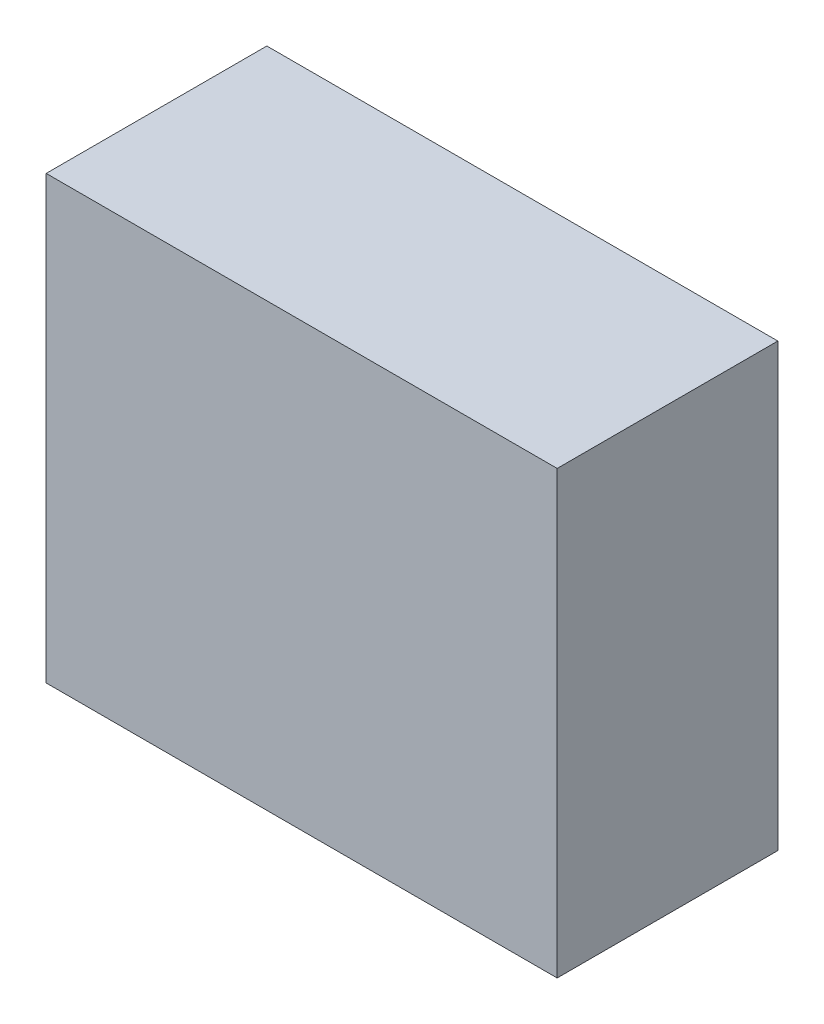
ISO-10303-21;
HEADER;
FILE_DESCRIPTION(('STEP AP214'),'2;1');
FILE_NAME('part.step','',(''),(''),'','','');
FILE_SCHEMA(('AUTOMOTIVE_DESIGN { 1 0 10303 214 1 1 1 1 }'));
ENDSEC;
DATA;
#1=APPLICATION_CONTEXT('core data for automotive mechanical design processes');
#2=APPLICATION_PROTOCOL_DEFINITION('international standard','automotive_design',2000,#1);
#3=PRODUCT_CONTEXT('',#1,'mechanical');
#4=PRODUCT('Part','Part','',(#3));
#5=PRODUCT_RELATED_PRODUCT_CATEGORY('part','',(#4));
#6=PRODUCT_DEFINITION_FORMATION('','',#4);
#7=PRODUCT_DEFINITION_CONTEXT('part definition',#1,'design');
#8=PRODUCT_DEFINITION('design','',#6,#7);
#9=PRODUCT_DEFINITION_SHAPE('','',#8);
#10=(LENGTH_UNIT() NAMED_UNIT(*) SI_UNIT(.MILLI.,.METRE.));
#11=(NAMED_UNIT(*) PLANE_ANGLE_UNIT() SI_UNIT($,.RADIAN.));
#12=(NAMED_UNIT(*) SI_UNIT($,.STERADIAN.) SOLID_ANGLE_UNIT());
#13=UNCERTAINTY_MEASURE_WITH_UNIT(LENGTH_MEASURE(1.E-05),#10,'distance_accuracy_value','');
#14=(GEOMETRIC_REPRESENTATION_CONTEXT(3) GLOBAL_UNCERTAINTY_ASSIGNED_CONTEXT((#13)) GLOBAL_UNIT_ASSIGNED_CONTEXT((#10,
#11,#12)) REPRESENTATION_CONTEXT('',''));
#15=CARTESIAN_POINT('',(0.,0.,0.));
#16=DIRECTION('',(0.,0.,1.));
#17=DIRECTION('',(1.,0.,0.));
#18=AXIS2_PLACEMENT_3D('',#15,#16,#17);
#19=CARTESIAN_POINT('',(-46.,-42.,119.));
#20=DIRECTION('',(1.,0.,0.));
#21=DIRECTION('',(0.,0.,-1.));
#22=AXIS2_PLACEMENT_3D('',#19,#20,#21);
#23=PLANE('',#22);
#24=DIRECTION('',(0.,-1.,0.));
#25=VECTOR('',#24,1.);
#26=CARTESIAN_POINT('',(-46.,-42.,100.));
#27=LINE('',#26,#25);
#28=CARTESIAN_POINT('',(-46.,-42.,100.));
#29=VERTEX_POINT('',#28);
#30=CARTESIAN_POINT('',(-46.,-80.,100.));
#31=VERTEX_POINT('',#30);
#32=EDGE_CURVE('E105',#29,#31,#27,.T.);
#33=ORIENTED_EDGE('',*,*,#32,.T.);
#34=DIRECTION('',(0.,0.,-1.));
#35=VECTOR('',#34,1.);
#36=CARTESIAN_POINT('',(-46.,-80.,119.));
#37=LINE('',#36,#35);
#38=CARTESIAN_POINT('',(-46.,-80.,119.));
#39=VERTEX_POINT('',#38);
#40=EDGE_CURVE('E11',#39,#31,#37,.T.);
#41=ORIENTED_EDGE('',*,*,#40,.F.);
#42=DIRECTION('',(0.,-1.,0.));
#43=VECTOR('',#42,1.);
#44=CARTESIAN_POINT('',(-46.,-42.,119.));
#45=LINE('',#44,#43);
#46=CARTESIAN_POINT('',(-46.,-42.,119.));
#47=VERTEX_POINT('',#46);
#48=EDGE_CURVE('E89',#47,#39,#45,.T.);
#49=ORIENTED_EDGE('',*,*,#48,.F.);
#50=DIRECTION('',(0.,0.,-1.));
#51=VECTOR('',#50,1.);
#52=CARTESIAN_POINT('',(-46.,-42.,119.));
#53=LINE('',#52,#51);
#54=EDGE_CURVE('E97',#47,#29,#53,.T.);
#55=ORIENTED_EDGE('',*,*,#54,.T.);
#56=EDGE_LOOP('',(#33,#41,#49,#55));
#57=FACE_BOUND('',#56,.T.);
#58=ADVANCED_FACE('F39',(#57),#23,.F.);
#59=CARTESIAN_POINT('',(-46.,-80.,119.));
#60=DIRECTION('',(0.,1.,0.));
#61=DIRECTION('',(0.,0.,1.));
#62=AXIS2_PLACEMENT_3D('',#59,#60,#61);
#63=PLANE('',#62);
#64=DIRECTION('',(1.,0.,0.));
#65=VECTOR('',#64,1.);
#66=CARTESIAN_POINT('',(-46.,-80.,100.));
#67=LINE('',#66,#65);
#68=CARTESIAN_POINT('',(-2.,-80.,100.));
#69=VERTEX_POINT('',#68);
#70=EDGE_CURVE('E92',#31,#69,#67,.T.);
#71=ORIENTED_EDGE('',*,*,#70,.T.);
#72=DIRECTION('',(0.,0.,-1.));
#73=VECTOR('',#72,1.);
#74=CARTESIAN_POINT('',(-2.,-80.,119.));
#75=LINE('',#74,#73);
#76=CARTESIAN_POINT('',(-2.,-80.,119.));
#77=VERTEX_POINT('',#76);
#78=EDGE_CURVE('E50',#77,#69,#75,.T.);
#79=ORIENTED_EDGE('',*,*,#78,.F.);
#80=DIRECTION('',(1.,0.,0.));
#81=VECTOR('',#80,1.);
#82=CARTESIAN_POINT('',(-46.,-80.,119.));
#83=LINE('',#82,#81);
#84=EDGE_CURVE('E82',#39,#77,#83,.T.);
#85=ORIENTED_EDGE('',*,*,#84,.F.);
#86=ORIENTED_EDGE('',*,*,#40,.T.);
#87=EDGE_LOOP('',(#71,#79,#85,#86));
#88=FACE_BOUND('',#87,.T.);
#89=ADVANCED_FACE('F93',(#88),#63,.F.);
#90=CARTESIAN_POINT('',(-2.,-80.,119.));
#91=DIRECTION('',(-1.,0.,0.));
#92=DIRECTION('',(0.,0.,1.));
#93=AXIS2_PLACEMENT_3D('',#90,#91,#92);
#94=PLANE('',#93);
#95=DIRECTION('',(0.,1.,0.));
#96=VECTOR('',#95,1.);
#97=CARTESIAN_POINT('',(-2.,-80.,100.));
#98=LINE('',#97,#96);
#99=CARTESIAN_POINT('',(-2.,-42.,100.));
#100=VERTEX_POINT('',#99);
#101=EDGE_CURVE('E74',#69,#100,#98,.T.);
#102=ORIENTED_EDGE('',*,*,#101,.T.);
#103=DIRECTION('',(0.,0.,-1.));
#104=VECTOR('',#103,1.);
#105=CARTESIAN_POINT('',(-2.,-42.,119.));
#106=LINE('',#105,#104);
#107=CARTESIAN_POINT('',(-2.,-42.,119.));
#108=VERTEX_POINT('',#107);
#109=EDGE_CURVE('E94',#108,#100,#106,.T.);
#110=ORIENTED_EDGE('',*,*,#109,.F.);
#111=DIRECTION('',(0.,1.,0.));
#112=VECTOR('',#111,1.);
#113=CARTESIAN_POINT('',(-2.,-80.,119.));
#114=LINE('',#113,#112);
#115=EDGE_CURVE('E88',#77,#108,#114,.T.);
#116=ORIENTED_EDGE('',*,*,#115,.F.);
#117=ORIENTED_EDGE('',*,*,#78,.T.);
#118=EDGE_LOOP('',(#102,#110,#116,#117));
#119=FACE_BOUND('',#118,.T.);
#120=ADVANCED_FACE('F96',(#119),#94,.F.);
#121=CARTESIAN_POINT('',(-2.,-42.,119.));
#122=DIRECTION('',(0.,-1.,0.));
#123=DIRECTION('',(0.,0.,-1.));
#124=AXIS2_PLACEMENT_3D('',#121,#122,#123);
#125=PLANE('',#124);
#126=DIRECTION('',(-1.,0.,0.));
#127=VECTOR('',#126,1.);
#128=CARTESIAN_POINT('',(-2.,-42.,100.));
#129=LINE('',#128,#127);
#130=EDGE_CURVE('E76',#100,#29,#129,.T.);
#131=ORIENTED_EDGE('',*,*,#130,.T.);
#132=ORIENTED_EDGE('',*,*,#54,.F.);
#133=DIRECTION('',(-1.,0.,0.));
#134=VECTOR('',#133,1.);
#135=CARTESIAN_POINT('',(-2.,-42.,119.));
#136=LINE('',#135,#134);
#137=EDGE_CURVE('E54',#108,#47,#136,.T.);
#138=ORIENTED_EDGE('',*,*,#137,.F.);
#139=ORIENTED_EDGE('',*,*,#109,.T.);
#140=EDGE_LOOP('',(#131,#132,#138,#139));
#141=FACE_BOUND('',#140,.T.);
#142=ADVANCED_FACE('F106',(#141),#125,.F.);
#143=CARTESIAN_POINT('',(0.,0.,119.));
#144=DIRECTION('',(0.,0.,1.));
#145=DIRECTION('',(1.,0.,0.));
#146=AXIS2_PLACEMENT_3D('',#143,#144,#145);
#147=PLANE('',#146);
#148=ORIENTED_EDGE('',*,*,#48,.T.);
#149=ORIENTED_EDGE('',*,*,#84,.T.);
#150=ORIENTED_EDGE('',*,*,#115,.T.);
#151=ORIENTED_EDGE('',*,*,#137,.T.);
#152=EDGE_LOOP('',(#148,#149,#150,#151));
#153=FACE_BOUND('',#152,.T.);
#154=ADVANCED_FACE('F86',(#153),#147,.T.);
#155=CARTESIAN_POINT('',(0.,0.,100.));
#156=DIRECTION('',(0.,0.,1.));
#157=DIRECTION('',(1.,0.,0.));
#158=AXIS2_PLACEMENT_3D('',#155,#156,#157);
#159=PLANE('',#158);
#160=ORIENTED_EDGE('',*,*,#32,.F.);
#161=ORIENTED_EDGE('',*,*,#130,.F.);
#162=ORIENTED_EDGE('',*,*,#101,.F.);
#163=ORIENTED_EDGE('',*,*,#70,.F.);
#164=EDGE_LOOP('',(#160,#161,#162,#163));
#165=FACE_BOUND('',#164,.T.);
#166=ADVANCED_FACE('F115',(#165),#159,.F.);
#167=CLOSED_SHELL('',(#58,#89,#120,#142,#154,#166));
#168=MANIFOLD_SOLID_BREP('B2',#167);
#169=ADVANCED_BREP_SHAPE_REPRESENTATION('',(#18,#168),#14);
#170=SHAPE_DEFINITION_REPRESENTATION(#9,#169);
ENDSEC;
END-ISO-10303-21;
